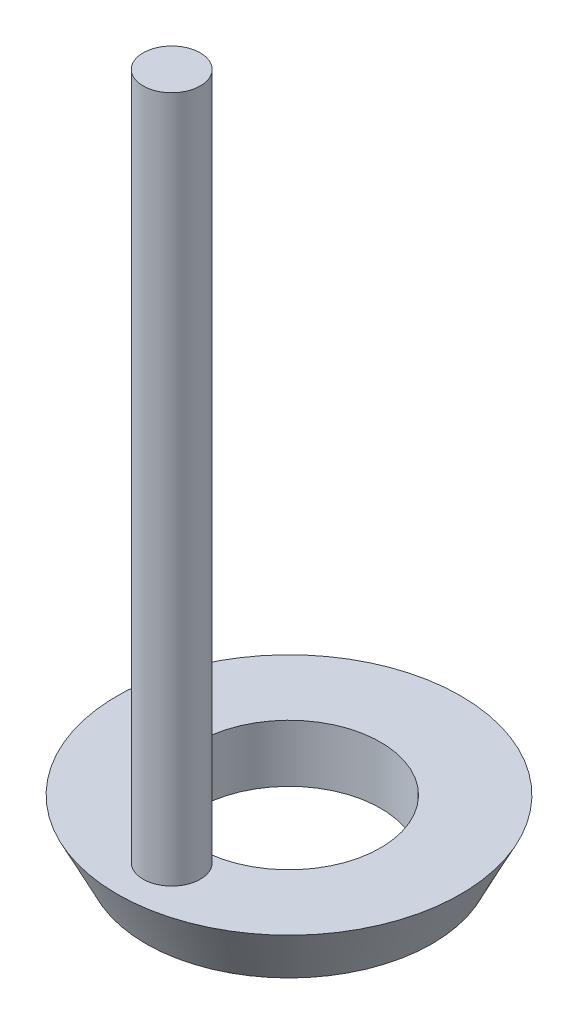
ISO-10303-21;
HEADER;
FILE_DESCRIPTION(('STEP AP214'),'2;1');
FILE_NAME('part.step','',(''),(''),'','','');
FILE_SCHEMA(('AUTOMOTIVE_DESIGN { 1 0 10303 214 1 1 1 1 }'));
ENDSEC;
DATA;
#1=APPLICATION_CONTEXT('core data for automotive mechanical design processes');
#2=APPLICATION_PROTOCOL_DEFINITION('international standard','automotive_design',2000,#1);
#3=PRODUCT_CONTEXT('',#1,'mechanical');
#4=PRODUCT('Part','Part','',(#3));
#5=PRODUCT_RELATED_PRODUCT_CATEGORY('part','',(#4));
#6=PRODUCT_DEFINITION_FORMATION('','',#4);
#7=PRODUCT_DEFINITION_CONTEXT('part definition',#1,'design');
#8=PRODUCT_DEFINITION('design','',#6,#7);
#9=PRODUCT_DEFINITION_SHAPE('','',#8);
#10=(LENGTH_UNIT() NAMED_UNIT(*) SI_UNIT(.MILLI.,.METRE.));
#11=(NAMED_UNIT(*) PLANE_ANGLE_UNIT() SI_UNIT($,.RADIAN.));
#12=(NAMED_UNIT(*) SI_UNIT($,.STERADIAN.) SOLID_ANGLE_UNIT());
#13=UNCERTAINTY_MEASURE_WITH_UNIT(LENGTH_MEASURE(1.E-05),#10,'distance_accuracy_value','');
#14=(GEOMETRIC_REPRESENTATION_CONTEXT(3) GLOBAL_UNCERTAINTY_ASSIGNED_CONTEXT((#13)) GLOBAL_UNIT_ASSIGNED_CONTEXT((#10,
#11,#12)) REPRESENTATION_CONTEXT('',''));
#15=CARTESIAN_POINT('',(0.,0.,0.));
#16=DIRECTION('',(0.,0.,1.));
#17=DIRECTION('',(1.,0.,0.));
#18=AXIS2_PLACEMENT_3D('',#15,#16,#17);
#19=CARTESIAN_POINT('',(0.,1.,0.));
#20=DIRECTION('',(0.,1.,0.));
#21=DIRECTION('',(0.,0.,1.));
#22=AXIS2_PLACEMENT_3D('',#19,#20,#21);
#23=PLANE('',#22);
#24=CARTESIAN_POINT('',(0.,1.,2.04838882231329));
#25=DIRECTION('',(0.,1.,0.));
#26=DIRECTION('',(0.,0.,1.));
#27=AXIS2_PLACEMENT_3D('',#24,#25,#26);
#28=CIRCLE('',#27,0.5);
#29=CARTESIAN_POINT('',(-0.19516710208039,1.,1.58805220388548));
#30=VERTEX_POINT('',#29);
#31=CARTESIAN_POINT('',(0.19516710208039,1.,1.58805220388548));
#32=VERTEX_POINT('',#31);
#33=EDGE_CURVE('E51',#30,#32,#28,.T.);
#34=ORIENTED_EDGE('',*,*,#33,.F.);
#35=CARTESIAN_POINT('',(0.,1.,0.));
#36=DIRECTION('',(0.,1.,0.));
#37=DIRECTION('',(0.,0.,1.));
#38=AXIS2_PLACEMENT_3D('',#35,#36,#37);
#39=CIRCLE('',#38,1.6);
#40=EDGE_CURVE('E58',#32,#30,#39,.T.);
#41=ORIENTED_EDGE('',*,*,#40,.F.);
#42=EDGE_LOOP('',(#34,#41));
#43=FACE_BOUND('',#42,.T.);
#44=CARTESIAN_POINT('',(0.,1.,0.));
#45=DIRECTION('',(0.,1.,0.));
#46=DIRECTION('',(0.,0.,1.));
#47=AXIS2_PLACEMENT_3D('',#44,#45,#46);
#48=CIRCLE('',#47,3.);
#49=CARTESIAN_POINT('',(0.,1.,3.));
#50=VERTEX_POINT('',#49);
#51=EDGE_CURVE('E77',#50,#50,#48,.T.);
#52=ORIENTED_EDGE('',*,*,#51,.T.);
#53=EDGE_LOOP('',(#52));
#54=FACE_BOUND('',#53,.T.);
#55=ADVANCED_FACE('F41',(#43,#54),#23,.T.);
#56=CARTESIAN_POINT('',(0.,0.,0.));
#57=DIRECTION('',(0.,1.,0.));
#58=DIRECTION('',(0.,0.,1.));
#59=AXIS2_PLACEMENT_3D('',#56,#57,#58);
#60=PLANE('',#59);
#61=CARTESIAN_POINT('',(0.,0.,0.));
#62=DIRECTION('',(0.,1.,0.));
#63=DIRECTION('',(0.,0.,1.));
#64=AXIS2_PLACEMENT_3D('',#61,#62,#63);
#65=CIRCLE('',#64,2.5);
#66=CARTESIAN_POINT('',(0.,0.,2.5));
#67=VERTEX_POINT('',#66);
#68=EDGE_CURVE('E11',#67,#67,#65,.F.);
#69=ORIENTED_EDGE('',*,*,#68,.T.);
#70=EDGE_LOOP('',(#69));
#71=FACE_BOUND('',#70,.T.);
#72=CARTESIAN_POINT('',(0.,0.,0.));
#73=DIRECTION('',(0.,1.,0.));
#74=DIRECTION('',(0.,0.,1.));
#75=AXIS2_PLACEMENT_3D('',#72,#73,#74);
#76=CIRCLE('',#75,1.6);
#77=CARTESIAN_POINT('',(0.,0.,1.6));
#78=VERTEX_POINT('',#77);
#79=EDGE_CURVE('E64',#78,#78,#76,.T.);
#80=ORIENTED_EDGE('',*,*,#79,.T.);
#81=EDGE_LOOP('',(#80));
#82=FACE_BOUND('',#81,.T.);
#83=ADVANCED_FACE('F100',(#71,#82),#60,.F.);
#84=CARTESIAN_POINT('',(0.,0.,0.));
#85=DIRECTION('',(0.,1.,0.));
#86=DIRECTION('',(0.,0.,1.));
#87=AXIS2_PLACEMENT_3D('',#84,#85,#86);
#88=CYLINDRICAL_SURFACE('',#87,1.6);
#89=ORIENTED_EDGE('',*,*,#79,.F.);
#90=EDGE_LOOP('',(#89));
#91=FACE_BOUND('',#90,.T.);
#92=ORIENTED_EDGE('',*,*,#40,.T.);
#93=EDGE_CURVE('E65',#30,#32,#39,.T.);
#94=ORIENTED_EDGE('',*,*,#93,.T.);
#95=EDGE_LOOP('',(#92,#94));
#96=FACE_BOUND('',#95,.T.);
#97=ADVANCED_FACE('F67',(#91,#96),#88,.F.);
#98=CARTESIAN_POINT('',(0.,13.,2.04838882231329));
#99=DIRECTION('',(0.,-1.,0.));
#100=DIRECTION('',(0.,0.,-1.));
#101=AXIS2_PLACEMENT_3D('',#98,#99,#100);
#102=CYLINDRICAL_SURFACE('',#101,0.5);
#103=CARTESIAN_POINT('',(0.,13.,2.04838882231329));
#104=DIRECTION('',(0.,1.,0.));
#105=DIRECTION('',(0.,0.,1.));
#106=AXIS2_PLACEMENT_3D('',#103,#104,#105);
#107=CIRCLE('',#106,0.5);
#108=CARTESIAN_POINT('',(0.,13.,2.54838882231329));
#109=VERTEX_POINT('',#108);
#110=EDGE_CURVE('E72',#109,#109,#107,.T.);
#111=ORIENTED_EDGE('',*,*,#110,.F.);
#112=EDGE_LOOP('',(#111));
#113=FACE_BOUND('',#112,.T.);
#114=EDGE_CURVE('E75',#32,#30,#28,.T.);
#115=ORIENTED_EDGE('',*,*,#114,.T.);
#116=ORIENTED_EDGE('',*,*,#33,.T.);
#117=EDGE_LOOP('',(#115,#116));
#118=FACE_BOUND('',#117,.T.);
#119=ADVANCED_FACE('F74',(#113,#118),#102,.T.);
#120=CARTESIAN_POINT('',(0.,13.,2.04838882231329));
#121=DIRECTION('',(0.,1.,0.));
#122=DIRECTION('',(0.,0.,1.));
#123=AXIS2_PLACEMENT_3D('',#120,#121,#122);
#124=PLANE('',#123);
#125=ORIENTED_EDGE('',*,*,#110,.T.);
#126=EDGE_LOOP('',(#125));
#127=FACE_BOUND('',#126,.T.);
#128=ADVANCED_FACE('F96',(#127),#124,.T.);
#129=CARTESIAN_POINT('',(0.,1.,2.04838882231329));
#130=DIRECTION('',(0.,1.,0.));
#131=DIRECTION('',(0.,0.,1.));
#132=AXIS2_PLACEMENT_3D('',#129,#130,#131);
#133=PLANE('',#132);
#134=ORIENTED_EDGE('',*,*,#93,.F.);
#135=ORIENTED_EDGE('',*,*,#114,.F.);
#136=EDGE_LOOP('',(#134,#135));
#137=FACE_BOUND('',#136,.T.);
#138=ADVANCED_FACE('F79',(#137),#133,.F.);
#139=CARTESIAN_POINT('',(0.,1.00000000000001,0.));
#140=DIRECTION('',(0.,1.,0.));
#141=DIRECTION('',(0.,0.,1.));
#142=AXIS2_PLACEMENT_3D('',#139,#140,#141);
#143=CONICAL_SURFACE('',#142,3.,0.463647609000805);
#144=ORIENTED_EDGE('',*,*,#68,.F.);
#145=EDGE_LOOP('',(#144));
#146=FACE_BOUND('',#145,.T.);
#147=ORIENTED_EDGE('',*,*,#51,.F.);
#148=EDGE_LOOP('',(#147));
#149=FACE_BOUND('',#148,.T.);
#150=ADVANCED_FACE('F44',(#146,#149),#143,.T.);
#151=CLOSED_SHELL('',(#55,#83,#97,#119,#128,#138,#150));
#152=MANIFOLD_SOLID_BREP('B2',#151);
#153=ADVANCED_BREP_SHAPE_REPRESENTATION('',(#18,#152),#14);
#154=SHAPE_DEFINITION_REPRESENTATION(#9,#153);
ENDSEC;
END-ISO-10303-21;
